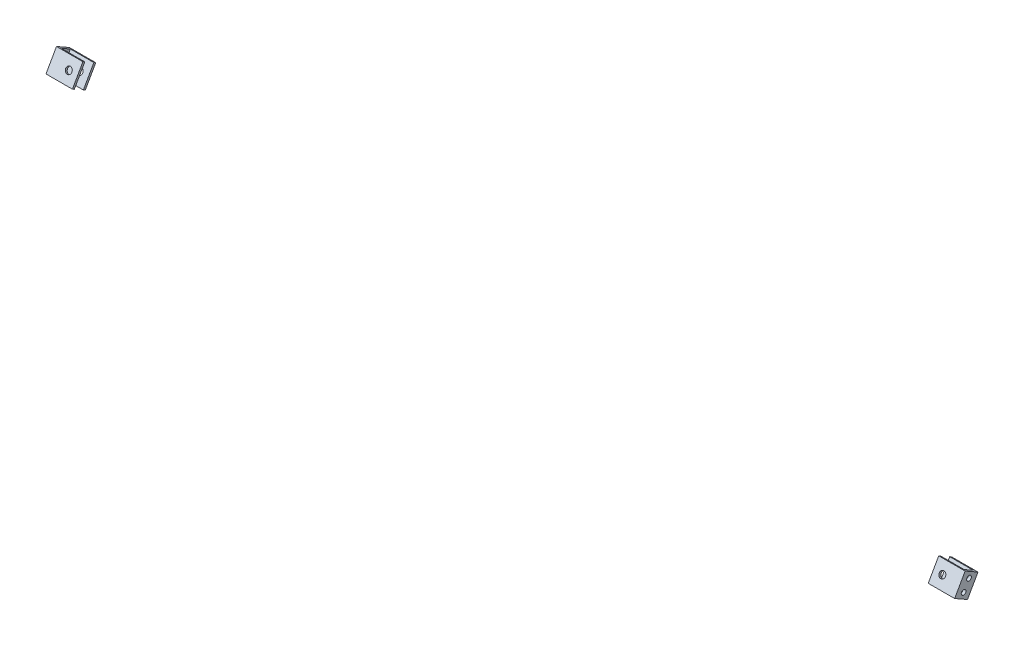
ISO-10303-21;
HEADER;
FILE_DESCRIPTION(('STEP AP214'),'2;1');
FILE_NAME('part.step','',(''),(''),'','','');
FILE_SCHEMA(('AUTOMOTIVE_DESIGN { 1 0 10303 214 1 1 1 1 }'));
ENDSEC;
DATA;
#1=APPLICATION_CONTEXT('core data for automotive mechanical design processes');
#2=APPLICATION_PROTOCOL_DEFINITION('international standard','automotive_design',2000,#1);
#3=PRODUCT_CONTEXT('',#1,'mechanical');
#4=PRODUCT('Part','Part','',(#3));
#5=PRODUCT_RELATED_PRODUCT_CATEGORY('part','',(#4));
#6=PRODUCT_DEFINITION_FORMATION('','',#4);
#7=PRODUCT_DEFINITION_CONTEXT('part definition',#1,'design');
#8=PRODUCT_DEFINITION('design','',#6,#7);
#9=PRODUCT_DEFINITION_SHAPE('','',#8);
#10=(LENGTH_UNIT() NAMED_UNIT(*) SI_UNIT(.MILLI.,.METRE.));
#11=(NAMED_UNIT(*) PLANE_ANGLE_UNIT() SI_UNIT($,.RADIAN.));
#12=(NAMED_UNIT(*) SI_UNIT($,.STERADIAN.) SOLID_ANGLE_UNIT());
#13=UNCERTAINTY_MEASURE_WITH_UNIT(LENGTH_MEASURE(1.E-05),#10,'distance_accuracy_value','');
#14=(GEOMETRIC_REPRESENTATION_CONTEXT(3) GLOBAL_UNCERTAINTY_ASSIGNED_CONTEXT((#13)) GLOBAL_UNIT_ASSIGNED_CONTEXT((#10,
#11,#12)) REPRESENTATION_CONTEXT('',''));
#15=CARTESIAN_POINT('',(0.,0.,0.));
#16=DIRECTION('',(0.,0.,1.));
#17=DIRECTION('',(1.,0.,0.));
#18=AXIS2_PLACEMENT_3D('',#15,#16,#17);
#19=CARTESIAN_POINT('',(459.128999952,901.235804059875,-1027.71365527703));
#20=DIRECTION('',(1.,0.,0.));
#21=DIRECTION('',(0.,0.,1.));
#22=AXIS2_PLACEMENT_3D('',#19,#20,#21);
#23=PLANE('',#22);
#24=DIRECTION('',(0.,0.492683829577063,0.87020839117609));
#25=VECTOR('',#24,1.);
#26=CARTESIAN_POINT('',(459.128999952,881.342840237589,-1016.4509029329));
#27=LINE('',#26,#25);
#28=CARTESIAN_POINT('',(459.128999952,887.990992662945,-1004.70852845446));
#29=VERTEX_POINT('',#28);
#30=CARTESIAN_POINT('',(459.128999952,889.164196032125,-1002.63634472297));
#31=VERTEX_POINT('',#30);
#32=EDGE_CURVE('E174',#29,#31,#27,.T.);
#33=ORIENTED_EDGE('',*,*,#32,.T.);
#34=DIRECTION('',(0.,-0.87020839117609,0.492683829577064));
#35=VECTOR('',#34,1.);
#36=CARTESIAN_POINT('',(459.128999952,909.057159854411,-1013.89909706711));
#37=LINE('',#36,#35);
#38=CARTESIAN_POINT('',(459.128999952,909.057159854411,-1013.89909706711));
#39=VERTEX_POINT('',#38);
#40=EDGE_CURVE('E167',#39,#31,#37,.T.);
#41=ORIENTED_EDGE('',*,*,#40,.F.);
#42=DIRECTION('',(0.,0.492683829577063,0.87020839117609));
#43=VECTOR('',#42,1.);
#44=CARTESIAN_POINT('',(459.128999952,901.235804059875,-1027.71365527703));
#45=LINE('',#44,#43);
#46=CARTESIAN_POINT('',(459.128999952,907.88395648523,-1015.97128079859));
#47=VERTEX_POINT('',#46);
#48=EDGE_CURVE('E183',#47,#39,#45,.T.);
#49=ORIENTED_EDGE('',*,*,#48,.F.);
#50=DIRECTION('',(0.,0.87020839117609,-0.492683829577063));
#51=VECTOR('',#50,1.);
#52=CARTESIAN_POINT('',(459.128999952,907.88395648523,-1015.97128079859));
#53=LINE('',#52,#51);
#54=EDGE_CURVE('E152',#29,#47,#53,.T.);
#55=ORIENTED_EDGE('',*,*,#54,.F.);
#56=EDGE_LOOP('',(#33,#41,#49,#55));
#57=FACE_BOUND('',#56,.T.);
#58=ADVANCED_FACE('F49',(#57),#23,.F.);
#59=CARTESIAN_POINT('',(468.653999952,891.289322148732,-1022.08227910496));
#60=DIRECTION('',(0.,0.492683829577063,0.87020839117609));
#61=DIRECTION('',(0.,-0.870208391176091,0.492683829577063));
#62=AXIS2_PLACEMENT_3D('',#59,#60,#61);
#63=CYLINDRICAL_SURFACE('',#62,3.37820000000002);
#64=CARTESIAN_POINT('',(468.653999952,897.937474574087,-1010.33990462653));
#65=DIRECTION('',(0.,-0.492683829577063,-0.87020839117609));
#66=DIRECTION('',(0.,-0.87020839117609,0.492683829577063));
#67=AXIS2_PLACEMENT_3D('',#64,#65,#66);
#68=CIRCLE('',#67,3.37820000000002);
#69=CARTESIAN_POINT('',(468.653999952,894.997736587016,-1008.67552011345));
#70=VERTEX_POINT('',#69);
#71=EDGE_CURVE('E151',#70,#70,#68,.T.);
#72=ORIENTED_EDGE('',*,*,#71,.T.);
#73=EDGE_LOOP('',(#72));
#74=FACE_BOUND('',#73,.T.);
#75=CARTESIAN_POINT('',(468.653999952,899.110677943268,-1008.26772089504));
#76=DIRECTION('',(0.,0.492683829577063,0.870208391176091));
#77=DIRECTION('',(0.,0.870208391176091,-0.492683829577063));
#78=AXIS2_PLACEMENT_3D('',#75,#76,#77);
#79=CIRCLE('',#78,3.37820000000002);
#80=CARTESIAN_POINT('',(468.653999952,902.050415930339,-1009.93210540812));
#81=VERTEX_POINT('',#80);
#82=EDGE_CURVE('E158',#81,#81,#79,.T.);
#83=ORIENTED_EDGE('',*,*,#82,.T.);
#84=EDGE_LOOP('',(#83));
#85=FACE_BOUND('',#84,.T.);
#86=ADVANCED_FACE('F220',(#74,#85),#63,.F.);
#87=CARTESIAN_POINT('',(0.,-221.855892676126,-391.855481850006));
#88=DIRECTION('',(0.,0.492683829577064,0.87020839117609));
#89=DIRECTION('',(0.,-0.87020839117609,0.492683829577064));
#90=AXIS2_PLACEMENT_3D('',#87,#88,#89);
#91=PLANE('',#90);
#92=DIRECTION('',(1.,0.,0.));
#93=VECTOR('',#92,1.);
#94=CARTESIAN_POINT('',(459.128999952,881.342840237589,-1016.4509029329));
#95=LINE('',#94,#93);
#96=CARTESIAN_POINT('',(459.128999952,881.342840237589,-1016.4509029329));
#97=VERTEX_POINT('',#96);
#98=CARTESIAN_POINT('',(487.449999952,881.342840237589,-1016.4509029329));
#99=VERTEX_POINT('',#98);
#100=EDGE_CURVE('E164',#97,#99,#95,.T.);
#101=ORIENTED_EDGE('',*,*,#100,.F.);
#102=DIRECTION('',(0.,-0.87020839117609,0.492683829577064));
#103=VECTOR('',#102,1.);
#104=CARTESIAN_POINT('',(459.128999952,901.235804059875,-1027.71365527703));
#105=LINE('',#104,#103);
#106=CARTESIAN_POINT('',(459.128999952,901.235804059875,-1027.71365527703));
#107=VERTEX_POINT('',#106);
#108=EDGE_CURVE('E172',#107,#97,#105,.T.);
#109=ORIENTED_EDGE('',*,*,#108,.F.);
#110=DIRECTION('',(-1.,0.,0.));
#111=VECTOR('',#110,1.);
#112=CARTESIAN_POINT('',(487.449999952,901.235804059875,-1027.71365527703));
#113=LINE('',#112,#111);
#114=CARTESIAN_POINT('',(487.449999952,901.235804059875,-1027.71365527703));
#115=VERTEX_POINT('',#114);
#116=EDGE_CURVE('E169',#115,#107,#113,.T.);
#117=ORIENTED_EDGE('',*,*,#116,.F.);
#118=DIRECTION('',(0.,0.87020839117609,-0.492683829577064));
#119=VECTOR('',#118,1.);
#120=CARTESIAN_POINT('',(487.449999952,901.235804059875,-1027.71365527703));
#121=LINE('',#120,#119);
#122=EDGE_CURVE('E166',#99,#115,#121,.T.);
#123=ORIENTED_EDGE('',*,*,#122,.F.);
#124=EDGE_LOOP('',(#101,#109,#117,#123));
#125=FACE_BOUND('',#124,.T.);
#126=CARTESIAN_POINT('',(468.653999952,891.289322148732,-1022.08227910496));
#127=DIRECTION('',(0.,0.492683829577063,0.870208391176091));
#128=DIRECTION('',(0.,0.870208391176091,-0.492683829577063));
#129=AXIS2_PLACEMENT_3D('',#126,#127,#128);
#130=CIRCLE('',#129,3.37820000000002);
#131=CARTESIAN_POINT('',(468.653999952,894.229060135803,-1023.74666361804));
#132=VERTEX_POINT('',#131);
#133=EDGE_CURVE('E159',#132,#132,#130,.T.);
#134=ORIENTED_EDGE('',*,*,#133,.T.);
#135=EDGE_LOOP('',(#134));
#136=FACE_BOUND('',#135,.T.);
#137=ADVANCED_FACE('F227',(#125,#136),#91,.F.);
#138=CARTESIAN_POINT('',(0.,-214.03453688159,-378.040923640085));
#139=DIRECTION('',(0.,0.492683829577064,0.87020839117609));
#140=DIRECTION('',(0.,-0.87020839117609,0.492683829577064));
#141=AXIS2_PLACEMENT_3D('',#138,#139,#140);
#142=PLANE('',#141);
#143=DIRECTION('',(1.,0.,0.));
#144=VECTOR('',#143,1.);
#145=CARTESIAN_POINT('',(459.128999952,889.164196032125,-1002.63634472297));
#146=LINE('',#145,#144);
#147=CARTESIAN_POINT('',(487.449999952,889.164196032125,-1002.63634472297));
#148=VERTEX_POINT('',#147);
#149=EDGE_CURVE('E95',#31,#148,#146,.T.);
#150=ORIENTED_EDGE('',*,*,#149,.T.);
#151=DIRECTION('',(0.,0.87020839117609,-0.492683829577064));
#152=VECTOR('',#151,1.);
#153=CARTESIAN_POINT('',(487.449999952,909.057159854411,-1013.89909706711));
#154=LINE('',#153,#152);
#155=CARTESIAN_POINT('',(487.449999952,909.057159854411,-1013.89909706711));
#156=VERTEX_POINT('',#155);
#157=EDGE_CURVE('E176',#148,#156,#154,.T.);
#158=ORIENTED_EDGE('',*,*,#157,.T.);
#159=DIRECTION('',(-1.,0.,0.));
#160=VECTOR('',#159,1.);
#161=CARTESIAN_POINT('',(487.449999952,909.057159854411,-1013.89909706711));
#162=LINE('',#161,#160);
#163=EDGE_CURVE('E179',#156,#39,#162,.T.);
#164=ORIENTED_EDGE('',*,*,#163,.T.);
#165=ORIENTED_EDGE('',*,*,#40,.T.);
#166=EDGE_LOOP('',(#150,#158,#164,#165));
#167=FACE_BOUND('',#166,.T.);
#168=ORIENTED_EDGE('',*,*,#82,.F.);
#169=EDGE_LOOP('',(#168));
#170=FACE_BOUND('',#169,.T.);
#171=ADVANCED_FACE('F251',(#167,#170),#142,.T.);
#172=CARTESIAN_POINT('',(459.128999952,881.342840237589,-1016.4509029329));
#173=DIRECTION('',(0.,0.87020839117609,-0.492683829577063));
#174=DIRECTION('',(0.,0.492683829577063,0.870208391176091));
#175=AXIS2_PLACEMENT_3D('',#172,#173,#174);
#176=PLANE('',#175);
#177=DIRECTION('',(0.,-0.492683829577068,-0.870208391176088));
#178=VECTOR('',#177,1.);
#179=CARTESIAN_POINT('',(484.274999952,887.990992662945,-1004.70852845446));
#180=LINE('',#179,#178);
#181=CARTESIAN_POINT('',(484.274999952,887.990992662945,-1004.70852845446));
#182=VERTEX_POINT('',#181);
#183=CARTESIAN_POINT('',(484.274999952,882.51604360677,-1014.37871920141));
#184=VERTEX_POINT('',#183);
#185=EDGE_CURVE('E128',#182,#184,#180,.T.);
#186=ORIENTED_EDGE('',*,*,#185,.T.);
#187=DIRECTION('',(-1.,0.,0.));
#188=VECTOR('',#187,1.);
#189=CARTESIAN_POINT('',(484.274999952,882.51604360677,-1014.37871920141));
#190=LINE('',#189,#188);
#191=CARTESIAN_POINT('',(459.128999952,882.51604360677,-1014.37871920141));
#192=VERTEX_POINT('',#191);
#193=EDGE_CURVE('E134',#184,#192,#190,.T.);
#194=ORIENTED_EDGE('',*,*,#193,.T.);
#195=EDGE_CURVE('E74',#97,#192,#27,.T.);
#196=ORIENTED_EDGE('',*,*,#195,.F.);
#197=ORIENTED_EDGE('',*,*,#100,.T.);
#198=DIRECTION('',(0.,0.492683829577063,0.87020839117609));
#199=VECTOR('',#198,1.);
#200=CARTESIAN_POINT('',(487.449999952,881.342840237589,-1016.4509029329));
#201=LINE('',#200,#199);
#202=EDGE_CURVE('E58',#99,#148,#201,.T.);
#203=ORIENTED_EDGE('',*,*,#202,.T.);
#204=ORIENTED_EDGE('',*,*,#149,.F.);
#205=ORIENTED_EDGE('',*,*,#32,.F.);
#206=DIRECTION('',(1.,0.,0.));
#207=VECTOR('',#206,1.);
#208=CARTESIAN_POINT('',(484.274999952,887.990992662945,-1004.70852845446));
#209=LINE('',#208,#207);
#210=EDGE_CURVE('E132',#29,#182,#209,.T.);
#211=ORIENTED_EDGE('',*,*,#210,.T.);
#212=EDGE_LOOP('',(#186,#194,#196,#197,#203,#204,#205,#211));
#213=FACE_BOUND('',#212,.T.);
#214=ADVANCED_FACE('F51',(#213),#176,.F.);
#215=CARTESIAN_POINT('',(487.449999952,901.235804059875,-1027.71365527703));
#216=DIRECTION('',(-1.,0.,0.));
#217=DIRECTION('',(0.,0.,-1.));
#218=AXIS2_PLACEMENT_3D('',#215,#216,#217);
#219=PLANE('',#218);
#220=CARTESIAN_POINT('',(487.449999952,900.305860760387,-1018.06577310166));
#221=DIRECTION('',(-1.,0.,0.));
#222=DIRECTION('',(0.,0.,1.));
#223=AXIS2_PLACEMENT_3D('',#220,#221,#222);
#224=CIRCLE('',#223,2.55270000000026);
#225=CARTESIAN_POINT('',(487.449999952,900.305860760387,-1015.51307310166));
#226=VERTEX_POINT('',#225);
#227=EDGE_CURVE('E194',#226,#226,#224,.T.);
#228=ORIENTED_EDGE('',*,*,#227,.T.);
#229=EDGE_LOOP('',(#228));
#230=FACE_BOUND('',#229,.T.);
#231=CARTESIAN_POINT('',(487.449999952,890.094139331613,-1012.28422689834));
#232=DIRECTION('',(-1.,0.,0.));
#233=DIRECTION('',(0.,0.,1.));
#234=AXIS2_PLACEMENT_3D('',#231,#232,#233);
#235=CIRCLE('',#234,2.55270000000005);
#236=CARTESIAN_POINT('',(487.449999952,890.094139331613,-1009.73152689834));
#237=VERTEX_POINT('',#236);
#238=EDGE_CURVE('E142',#237,#237,#235,.T.);
#239=ORIENTED_EDGE('',*,*,#238,.T.);
#240=EDGE_LOOP('',(#239));
#241=FACE_BOUND('',#240,.T.);
#242=ORIENTED_EDGE('',*,*,#157,.F.);
#243=ORIENTED_EDGE('',*,*,#202,.F.);
#244=ORIENTED_EDGE('',*,*,#122,.T.);
#245=DIRECTION('',(0.,0.492683829577063,0.87020839117609));
#246=VECTOR('',#245,1.);
#247=CARTESIAN_POINT('',(487.449999952,901.235804059875,-1027.71365527703));
#248=LINE('',#247,#246);
#249=EDGE_CURVE('E187',#115,#156,#248,.T.);
#250=ORIENTED_EDGE('',*,*,#249,.T.);
#251=EDGE_LOOP('',(#242,#243,#244,#250));
#252=FACE_BOUND('',#251,.T.);
#253=ADVANCED_FACE('F203',(#230,#241,#252),#219,.F.);
#254=CARTESIAN_POINT('',(487.449999952,901.235804059875,-1027.71365527703));
#255=DIRECTION('',(0.,-0.87020839117609,0.492683829577063));
#256=DIRECTION('',(0.,-0.492683829577063,-0.870208391176091));
#257=AXIS2_PLACEMENT_3D('',#254,#255,#256);
#258=PLANE('',#257);
#259=ORIENTED_EDGE('',*,*,#48,.T.);
#260=ORIENTED_EDGE('',*,*,#163,.F.);
#261=ORIENTED_EDGE('',*,*,#249,.F.);
#262=ORIENTED_EDGE('',*,*,#116,.T.);
#263=CARTESIAN_POINT('',(459.128999952,902.409007429055,-1025.64147154554));
#264=VERTEX_POINT('',#263);
#265=EDGE_CURVE('E184',#107,#264,#45,.T.);
#266=ORIENTED_EDGE('',*,*,#265,.T.);
#267=DIRECTION('',(-1.,0.,0.));
#268=VECTOR('',#267,1.);
#269=CARTESIAN_POINT('',(487.449999952,902.409007429055,-1025.64147154554));
#270=LINE('',#269,#268);
#271=CARTESIAN_POINT('',(484.274999952,902.409007429055,-1025.64147154554));
#272=VERTEX_POINT('',#271);
#273=EDGE_CURVE('E149',#272,#264,#270,.T.);
#274=ORIENTED_EDGE('',*,*,#273,.F.);
#275=DIRECTION('',(0.,-0.492683829577063,-0.870208391176091));
#276=VECTOR('',#275,1.);
#277=CARTESIAN_POINT('',(484.274999952,901.235804059875,-1027.71365527703));
#278=LINE('',#277,#276);
#279=CARTESIAN_POINT('',(484.274999952,907.88395648523,-1015.97128079859));
#280=VERTEX_POINT('',#279);
#281=EDGE_CURVE('E12',#280,#272,#278,.T.);
#282=ORIENTED_EDGE('',*,*,#281,.F.);
#283=DIRECTION('',(1.,0.,0.));
#284=VECTOR('',#283,1.);
#285=CARTESIAN_POINT('',(487.449999952,907.88395648523,-1015.97128079859));
#286=LINE('',#285,#284);
#287=EDGE_CURVE('E155',#47,#280,#286,.T.);
#288=ORIENTED_EDGE('',*,*,#287,.F.);
#289=EDGE_LOOP('',(#259,#260,#261,#262,#266,#274,#282,#288));
#290=FACE_BOUND('',#289,.T.);
#291=ADVANCED_FACE('F235',(#290),#258,.F.);
#292=ORIENTED_EDGE('',*,*,#265,.F.);
#293=ORIENTED_EDGE('',*,*,#108,.T.);
#294=ORIENTED_EDGE('',*,*,#195,.T.);
#295=DIRECTION('',(0.,-0.87020839117609,0.492683829577063));
#296=VECTOR('',#295,1.);
#297=CARTESIAN_POINT('',(459.128999952,902.409007429055,-1025.64147154554));
#298=LINE('',#297,#296);
#299=EDGE_CURVE('E66',#264,#192,#298,.T.);
#300=ORIENTED_EDGE('',*,*,#299,.F.);
#301=EDGE_LOOP('',(#292,#293,#294,#300));
#302=FACE_BOUND('',#301,.T.);
#303=ADVANCED_FACE('F223',(#302),#23,.F.);
#304=CARTESIAN_POINT('',(468.653999952,892.462525517912,-1020.01009537347));
#305=DIRECTION('',(0.,0.492683829577063,0.87020839117609));
#306=DIRECTION('',(0.,0.87020839117609,-0.492683829577063));
#307=AXIS2_PLACEMENT_3D('',#304,#305,#306);
#308=CIRCLE('',#307,3.37820000000002);
#309=CARTESIAN_POINT('',(468.653999952,895.402263504983,-1021.67447988655));
#310=VERTEX_POINT('',#309);
#311=EDGE_CURVE('E146',#310,#310,#308,.T.);
#312=ORIENTED_EDGE('',*,*,#311,.T.);
#313=EDGE_LOOP('',(#312));
#314=FACE_BOUND('',#313,.T.);
#315=ORIENTED_EDGE('',*,*,#133,.F.);
#316=EDGE_LOOP('',(#315));
#317=FACE_BOUND('',#316,.T.);
#318=ADVANCED_FACE('F230',(#314,#317),#63,.F.);
#319=CARTESIAN_POINT('',(484.274999952,913.806777054439,-1019.32459013177));
#320=DIRECTION('',(1.,0.,0.));
#321=DIRECTION('',(0.,0.,1.));
#322=AXIS2_PLACEMENT_3D('',#319,#320,#321);
#323=PLANE('',#322);
#324=CARTESIAN_POINT('',(484.274999952,900.305860760387,-1018.06577310166));
#325=DIRECTION('',(-1.,0.,0.));
#326=DIRECTION('',(0.,0.,1.));
#327=AXIS2_PLACEMENT_3D('',#324,#325,#326);
#328=CIRCLE('',#327,2.55270000000026);
#329=CARTESIAN_POINT('',(484.274999952,900.305860760387,-1015.51307310166));
#330=VERTEX_POINT('',#329);
#331=EDGE_CURVE('E53',#330,#330,#328,.T.);
#332=ORIENTED_EDGE('',*,*,#331,.F.);
#333=EDGE_LOOP('',(#332));
#334=FACE_BOUND('',#333,.T.);
#335=CARTESIAN_POINT('',(484.274999952,890.094139331613,-1012.28422689834));
#336=DIRECTION('',(-1.,0.,0.));
#337=DIRECTION('',(0.,0.,1.));
#338=AXIS2_PLACEMENT_3D('',#335,#336,#337);
#339=CIRCLE('',#338,2.55270000000005);
#340=CARTESIAN_POINT('',(484.274999952,890.094139331613,-1009.73152689834));
#341=VERTEX_POINT('',#340);
#342=EDGE_CURVE('E140',#341,#341,#339,.T.);
#343=ORIENTED_EDGE('',*,*,#342,.F.);
#344=EDGE_LOOP('',(#343));
#345=FACE_BOUND('',#344,.T.);
#346=DIRECTION('',(0.,-0.87020839117609,0.492683829577063));
#347=VECTOR('',#346,1.);
#348=CARTESIAN_POINT('',(484.274999952,913.806777054439,-1019.32459013177));
#349=LINE('',#348,#347);
#350=EDGE_CURVE('E131',#280,#182,#349,.T.);
#351=ORIENTED_EDGE('',*,*,#350,.F.);
#352=ORIENTED_EDGE('',*,*,#281,.T.);
#353=DIRECTION('',(0.,-0.87020839117609,0.492683829577063));
#354=VECTOR('',#353,1.);
#355=CARTESIAN_POINT('',(484.274999952,908.331827998263,-1028.99478087871));
#356=LINE('',#355,#354);
#357=EDGE_CURVE('E125',#272,#184,#356,.T.);
#358=ORIENTED_EDGE('',*,*,#357,.T.);
#359=ORIENTED_EDGE('',*,*,#185,.F.);
#360=EDGE_LOOP('',(#351,#352,#358,#359));
#361=FACE_BOUND('',#360,.T.);
#362=ADVANCED_FACE('F126',(#334,#345,#361),#323,.F.);
#363=CARTESIAN_POINT('',(484.274999952,913.806777054439,-1019.32459013177));
#364=DIRECTION('',(0.,0.492683829577063,0.87020839117609));
#365=DIRECTION('',(0.,-0.87020839117609,0.492683829577063));
#366=AXIS2_PLACEMENT_3D('',#363,#364,#365);
#367=PLANE('',#366);
#368=ORIENTED_EDGE('',*,*,#71,.F.);
#369=EDGE_LOOP('',(#368));
#370=FACE_BOUND('',#369,.T.);
#371=ORIENTED_EDGE('',*,*,#54,.T.);
#372=ORIENTED_EDGE('',*,*,#287,.T.);
#373=ORIENTED_EDGE('',*,*,#350,.T.);
#374=ORIENTED_EDGE('',*,*,#210,.F.);
#375=EDGE_LOOP('',(#371,#372,#373,#374));
#376=FACE_BOUND('',#375,.T.);
#377=ADVANCED_FACE('F215',(#370,#376),#367,.F.);
#378=CARTESIAN_POINT('',(484.274999952,908.331827998263,-1028.99478087871));
#379=DIRECTION('',(0.,-0.492683829577063,-0.87020839117609));
#380=DIRECTION('',(0.,0.87020839117609,-0.492683829577063));
#381=AXIS2_PLACEMENT_3D('',#378,#379,#380);
#382=PLANE('',#381);
#383=ORIENTED_EDGE('',*,*,#311,.F.);
#384=EDGE_LOOP('',(#383));
#385=FACE_BOUND('',#384,.T.);
#386=ORIENTED_EDGE('',*,*,#357,.F.);
#387=ORIENTED_EDGE('',*,*,#273,.T.);
#388=ORIENTED_EDGE('',*,*,#299,.T.);
#389=ORIENTED_EDGE('',*,*,#193,.F.);
#390=EDGE_LOOP('',(#386,#387,#388,#389));
#391=FACE_BOUND('',#390,.T.);
#392=ADVANCED_FACE('F135',(#385,#391),#382,.F.);
#393=CARTESIAN_POINT('',(459.128999952,890.094139331613,-1012.28422689834));
#394=DIRECTION('',(1.,0.,0.));
#395=DIRECTION('',(0.,0.,1.));
#396=AXIS2_PLACEMENT_3D('',#393,#394,#395);
#397=CYLINDRICAL_SURFACE('',#396,2.55270000000005);
#398=ORIENTED_EDGE('',*,*,#238,.F.);
#399=EDGE_LOOP('',(#398));
#400=FACE_BOUND('',#399,.T.);
#401=ORIENTED_EDGE('',*,*,#342,.T.);
#402=EDGE_LOOP('',(#401));
#403=FACE_BOUND('',#402,.T.);
#404=ADVANCED_FACE('F205',(#400,#403),#397,.F.);
#405=CARTESIAN_POINT('',(459.128999952,900.305860760387,-1018.06577310166));
#406=DIRECTION('',(1.,0.,0.));
#407=DIRECTION('',(0.,0.,1.));
#408=AXIS2_PLACEMENT_3D('',#405,#406,#407);
#409=CYLINDRICAL_SURFACE('',#408,2.55270000000026);
#410=ORIENTED_EDGE('',*,*,#227,.F.);
#411=EDGE_LOOP('',(#410));
#412=FACE_BOUND('',#411,.T.);
#413=ORIENTED_EDGE('',*,*,#331,.T.);
#414=EDGE_LOOP('',(#413));
#415=FACE_BOUND('',#414,.T.);
#416=ADVANCED_FACE('F207',(#412,#415),#409,.F.);
#417=CLOSED_SHELL('',(#58,#86,#137,#171,#214,#253,#291,#303,#318,#362,#377,#392,#404,#416));
#418=MANIFOLD_SOLID_BREP('B2',#417);
#419=CARTESIAN_POINT('',(-459.128999952,901.235804059875,-1027.71365527703));
#420=DIRECTION('',(-1.,0.,0.));
#421=DIRECTION('',(0.,0.,1.));
#422=AXIS2_PLACEMENT_3D('',#419,#420,#421);
#423=PLANE('',#422);
#424=DIRECTION('',(0.,0.492683829577063,0.87020839117609));
#425=VECTOR('',#424,1.);
#426=CARTESIAN_POINT('',(-459.128999952,881.342840237589,-1016.4509029329));
#427=LINE('',#426,#425);
#428=CARTESIAN_POINT('',(-459.128999952,887.990992662945,-1004.70852845446));
#429=VERTEX_POINT('',#428);
#430=CARTESIAN_POINT('',(-459.128999952,889.164196032125,-1002.63634472297));
#431=VERTEX_POINT('',#430);
#432=EDGE_CURVE('E405',#429,#431,#427,.T.);
#433=ORIENTED_EDGE('',*,*,#432,.F.);
#434=DIRECTION('',(0.,0.87020839117609,-0.492683829577063));
#435=VECTOR('',#434,1.);
#436=CARTESIAN_POINT('',(-459.128999952,907.88395648523,-1015.97128079859));
#437=LINE('',#436,#435);
#438=CARTESIAN_POINT('',(-459.128999952,907.88395648523,-1015.97128079859));
#439=VERTEX_POINT('',#438);
#440=EDGE_CURVE('E461',#429,#439,#437,.T.);
#441=ORIENTED_EDGE('',*,*,#440,.T.);
#442=DIRECTION('',(0.,0.492683829577063,0.87020839117609));
#443=VECTOR('',#442,1.);
#444=CARTESIAN_POINT('',(-459.128999952,901.235804059875,-1027.71365527703));
#445=LINE('',#444,#443);
#446=CARTESIAN_POINT('',(-459.128999952,909.057159854411,-1013.89909706711));
#447=VERTEX_POINT('',#446);
#448=EDGE_CURVE('E489',#439,#447,#445,.T.);
#449=ORIENTED_EDGE('',*,*,#448,.T.);
#450=DIRECTION('',(0.,-0.87020839117609,0.492683829577064));
#451=VECTOR('',#450,1.);
#452=CARTESIAN_POINT('',(-459.128999952,909.057159854411,-1013.89909706711));
#453=LINE('',#452,#451);
#454=EDGE_CURVE('E476',#447,#431,#453,.T.);
#455=ORIENTED_EDGE('',*,*,#454,.T.);
#456=EDGE_LOOP('',(#433,#441,#449,#455));
#457=FACE_BOUND('',#456,.T.);
#458=ADVANCED_FACE('F357',(#457),#423,.F.);
#459=CARTESIAN_POINT('',(-468.653999952,891.289322148732,-1022.08227910496));
#460=DIRECTION('',(0.,0.492683829577063,0.87020839117609));
#461=DIRECTION('',(0.,-0.870208391176091,0.492683829577063));
#462=AXIS2_PLACEMENT_3D('',#459,#460,#461);
#463=CYLINDRICAL_SURFACE('',#462,3.37820000000002);
#464=CARTESIAN_POINT('',(-468.653999952,897.937474574087,-1010.33990462653));
#465=DIRECTION('',(0.,0.492683829577063,0.87020839117609));
#466=DIRECTION('',(0.,-0.87020839117609,0.492683829577063));
#467=AXIS2_PLACEMENT_3D('',#464,#465,#466);
#468=CIRCLE('',#467,3.37820000000002);
#469=CARTESIAN_POINT('',(-468.653999952,894.997736587016,-1008.67552011345));
#470=VERTEX_POINT('',#469);
#471=EDGE_CURVE('E460',#470,#470,#468,.T.);
#472=ORIENTED_EDGE('',*,*,#471,.F.);
#473=EDGE_LOOP('',(#472));
#474=FACE_BOUND('',#473,.T.);
#475=CARTESIAN_POINT('',(-468.653999952,899.110677943268,-1008.26772089504));
#476=DIRECTION('',(0.,-0.492683829577063,-0.870208391176091));
#477=DIRECTION('',(0.,0.870208391176091,-0.492683829577063));
#478=AXIS2_PLACEMENT_3D('',#475,#476,#477);
#479=CIRCLE('',#478,3.37820000000002);
#480=CARTESIAN_POINT('',(-468.653999952,902.050415930339,-1009.93210540812));
#481=VERTEX_POINT('',#480);
#482=EDGE_CURVE('E467',#481,#481,#479,.T.);
#483=ORIENTED_EDGE('',*,*,#482,.F.);
#484=EDGE_LOOP('',(#483));
#485=FACE_BOUND('',#484,.T.);
#486=ADVANCED_FACE('F550',(#474,#485),#463,.F.);
#487=CARTESIAN_POINT('',(0.,-221.855892676126,-391.855481850006));
#488=DIRECTION('',(0.,0.492683829577064,0.87020839117609));
#489=DIRECTION('',(0.,-0.87020839117609,0.492683829577064));
#490=AXIS2_PLACEMENT_3D('',#487,#488,#489);
#491=PLANE('',#490);
#492=DIRECTION('',(-1.,0.,0.));
#493=VECTOR('',#492,1.);
#494=CARTESIAN_POINT('',(-459.128999952,881.342840237589,-1016.4509029329));
#495=LINE('',#494,#493);
#496=CARTESIAN_POINT('',(-459.128999952,881.342840237589,-1016.4509029329));
#497=VERTEX_POINT('',#496);
#498=CARTESIAN_POINT('',(-487.449999952,881.342840237589,-1016.4509029329));
#499=VERTEX_POINT('',#498);
#500=EDGE_CURVE('E474',#497,#499,#495,.T.);
#501=ORIENTED_EDGE('',*,*,#500,.T.);
#502=DIRECTION('',(0.,0.87020839117609,-0.492683829577064));
#503=VECTOR('',#502,1.);
#504=CARTESIAN_POINT('',(-487.449999952,901.235804059875,-1027.71365527703));
#505=LINE('',#504,#503);
#506=CARTESIAN_POINT('',(-487.449999952,901.235804059875,-1027.71365527703));
#507=VERTEX_POINT('',#506);
#508=EDGE_CURVE('E413',#499,#507,#505,.T.);
#509=ORIENTED_EDGE('',*,*,#508,.T.);
#510=DIRECTION('',(1.,0.,0.));
#511=VECTOR('',#510,1.);
#512=CARTESIAN_POINT('',(-487.449999952,901.235804059875,-1027.71365527703));
#513=LINE('',#512,#511);
#514=CARTESIAN_POINT('',(-459.128999952,901.235804059875,-1027.71365527703));
#515=VERTEX_POINT('',#514);
#516=EDGE_CURVE('E478',#507,#515,#513,.T.);
#517=ORIENTED_EDGE('',*,*,#516,.T.);
#518=DIRECTION('',(0.,-0.87020839117609,0.492683829577064));
#519=VECTOR('',#518,1.);
#520=CARTESIAN_POINT('',(-459.128999952,901.235804059875,-1027.71365527703));
#521=LINE('',#520,#519);
#522=EDGE_CURVE('E383',#515,#497,#521,.T.);
#523=ORIENTED_EDGE('',*,*,#522,.T.);
#524=EDGE_LOOP('',(#501,#509,#517,#523));
#525=FACE_BOUND('',#524,.T.);
#526=CARTESIAN_POINT('',(-468.653999952,891.289322148732,-1022.08227910496));
#527=DIRECTION('',(0.,-0.492683829577063,-0.870208391176091));
#528=DIRECTION('',(0.,0.870208391176091,-0.492683829577063));
#529=AXIS2_PLACEMENT_3D('',#526,#527,#528);
#530=CIRCLE('',#529,3.37820000000002);
#531=CARTESIAN_POINT('',(-468.653999952,894.229060135803,-1023.74666361804));
#532=VERTEX_POINT('',#531);
#533=EDGE_CURVE('E468',#532,#532,#530,.T.);
#534=ORIENTED_EDGE('',*,*,#533,.F.);
#535=EDGE_LOOP('',(#534));
#536=FACE_BOUND('',#535,.T.);
#537=ADVANCED_FACE('F557',(#525,#536),#491,.F.);
#538=CARTESIAN_POINT('',(0.,-214.03453688159,-378.040923640085));
#539=DIRECTION('',(0.,0.492683829577064,0.87020839117609));
#540=DIRECTION('',(0.,-0.87020839117609,0.492683829577064));
#541=AXIS2_PLACEMENT_3D('',#538,#539,#540);
#542=PLANE('',#541);
#543=DIRECTION('',(-1.,0.,0.));
#544=VECTOR('',#543,1.);
#545=CARTESIAN_POINT('',(-459.128999952,889.164196032125,-1002.63634472297));
#546=LINE('',#545,#544);
#547=CARTESIAN_POINT('',(-487.449999952,889.164196032125,-1002.63634472297));
#548=VERTEX_POINT('',#547);
#549=EDGE_CURVE('E471',#431,#548,#546,.T.);
#550=ORIENTED_EDGE('',*,*,#549,.F.);
#551=ORIENTED_EDGE('',*,*,#454,.F.);
#552=DIRECTION('',(1.,0.,0.));
#553=VECTOR('',#552,1.);
#554=CARTESIAN_POINT('',(-487.449999952,909.057159854411,-1013.89909706711));
#555=LINE('',#554,#553);
#556=CARTESIAN_POINT('',(-487.449999952,909.057159854411,-1013.89909706711));
#557=VERTEX_POINT('',#556);
#558=EDGE_CURVE('E484',#557,#447,#555,.T.);
#559=ORIENTED_EDGE('',*,*,#558,.F.);
#560=DIRECTION('',(0.,0.87020839117609,-0.492683829577064));
#561=VECTOR('',#560,1.);
#562=CARTESIAN_POINT('',(-487.449999952,909.057159854411,-1013.89909706711));
#563=LINE('',#562,#561);
#564=EDGE_CURVE('E482',#548,#557,#563,.T.);
#565=ORIENTED_EDGE('',*,*,#564,.F.);
#566=EDGE_LOOP('',(#550,#551,#559,#565));
#567=FACE_BOUND('',#566,.T.);
#568=ORIENTED_EDGE('',*,*,#482,.T.);
#569=EDGE_LOOP('',(#568));
#570=FACE_BOUND('',#569,.T.);
#571=ADVANCED_FACE('F530',(#567,#570),#542,.T.);
#572=CARTESIAN_POINT('',(-459.128999952,881.342840237589,-1016.4509029329));
#573=DIRECTION('',(0.,0.87020839117609,-0.492683829577063));
#574=DIRECTION('',(0.,0.492683829577063,0.870208391176091));
#575=AXIS2_PLACEMENT_3D('',#572,#573,#574);
#576=PLANE('',#575);
#577=DIRECTION('',(0.,-0.492683829577068,-0.870208391176088));
#578=VECTOR('',#577,1.);
#579=CARTESIAN_POINT('',(-484.274999952,887.990992662945,-1004.70852845446));
#580=LINE('',#579,#578);
#581=CARTESIAN_POINT('',(-484.274999952,887.990992662945,-1004.70852845446));
#582=VERTEX_POINT('',#581);
#583=CARTESIAN_POINT('',(-484.274999952,882.51604360677,-1014.37871920141));
#584=VERTEX_POINT('',#583);
#585=EDGE_CURVE('E443',#582,#584,#580,.T.);
#586=ORIENTED_EDGE('',*,*,#585,.F.);
#587=DIRECTION('',(-1.,0.,0.));
#588=VECTOR('',#587,1.);
#589=CARTESIAN_POINT('',(-484.274999952,887.990992662945,-1004.70852845446));
#590=LINE('',#589,#588);
#591=EDGE_CURVE('E440',#429,#582,#590,.T.);
#592=ORIENTED_EDGE('',*,*,#591,.F.);
#593=ORIENTED_EDGE('',*,*,#432,.T.);
#594=ORIENTED_EDGE('',*,*,#549,.T.);
#595=DIRECTION('',(0.,0.492683829577063,0.87020839117609));
#596=VECTOR('',#595,1.);
#597=CARTESIAN_POINT('',(-487.449999952,881.342840237589,-1016.4509029329));
#598=LINE('',#597,#596);
#599=EDGE_CURVE('E366',#499,#548,#598,.T.);
#600=ORIENTED_EDGE('',*,*,#599,.F.);
#601=ORIENTED_EDGE('',*,*,#500,.F.);
#602=CARTESIAN_POINT('',(-459.128999952,882.51604360677,-1014.37871920141));
#603=VERTEX_POINT('',#602);
#604=EDGE_CURVE('E450',#497,#603,#427,.T.);
#605=ORIENTED_EDGE('',*,*,#604,.T.);
#606=DIRECTION('',(1.,0.,0.));
#607=VECTOR('',#606,1.);
#608=CARTESIAN_POINT('',(-484.274999952,882.51604360677,-1014.37871920141));
#609=LINE('',#608,#607);
#610=EDGE_CURVE('E374',#584,#603,#609,.T.);
#611=ORIENTED_EDGE('',*,*,#610,.F.);
#612=EDGE_LOOP('',(#586,#592,#593,#594,#600,#601,#605,#611));
#613=FACE_BOUND('',#612,.T.);
#614=ADVANCED_FACE('F359',(#613),#576,.F.);
#615=CARTESIAN_POINT('',(-487.449999952,901.235804059875,-1027.71365527703));
#616=DIRECTION('',(1.,0.,0.));
#617=DIRECTION('',(0.,0.,-1.));
#618=AXIS2_PLACEMENT_3D('',#615,#616,#617);
#619=PLANE('',#618);
#620=CARTESIAN_POINT('',(-487.449999952,900.305860760387,-1018.06577310166));
#621=DIRECTION('',(-1.,0.,0.));
#622=DIRECTION('',(0.,0.,1.));
#623=AXIS2_PLACEMENT_3D('',#620,#621,#622);
#624=CIRCLE('',#623,2.55270000000026);
#625=CARTESIAN_POINT('',(-487.449999952,900.305860760387,-1015.51307310166));
#626=VERTEX_POINT('',#625);
#627=EDGE_CURVE('E502',#626,#626,#624,.T.);
#628=ORIENTED_EDGE('',*,*,#627,.F.);
#629=EDGE_LOOP('',(#628));
#630=FACE_BOUND('',#629,.T.);
#631=CARTESIAN_POINT('',(-487.449999952,890.094139331613,-1012.28422689834));
#632=DIRECTION('',(-1.,0.,0.));
#633=DIRECTION('',(0.,0.,1.));
#634=AXIS2_PLACEMENT_3D('',#631,#632,#633);
#635=CIRCLE('',#634,2.55270000000005);
#636=CARTESIAN_POINT('',(-487.449999952,890.094139331613,-1009.73152689834));
#637=VERTEX_POINT('',#636);
#638=EDGE_CURVE('E507',#637,#637,#635,.T.);
#639=ORIENTED_EDGE('',*,*,#638,.F.);
#640=EDGE_LOOP('',(#639));
#641=FACE_BOUND('',#640,.T.);
#642=ORIENTED_EDGE('',*,*,#564,.T.);
#643=DIRECTION('',(0.,0.492683829577063,0.87020839117609));
#644=VECTOR('',#643,1.);
#645=CARTESIAN_POINT('',(-487.449999952,901.235804059875,-1027.71365527703));
#646=LINE('',#645,#644);
#647=EDGE_CURVE('E493',#507,#557,#646,.T.);
#648=ORIENTED_EDGE('',*,*,#647,.F.);
#649=ORIENTED_EDGE('',*,*,#508,.F.);
#650=ORIENTED_EDGE('',*,*,#599,.T.);
#651=EDGE_LOOP('',(#642,#648,#649,#650));
#652=FACE_BOUND('',#651,.T.);
#653=ADVANCED_FACE('F517',(#630,#641,#652),#619,.F.);
#654=CARTESIAN_POINT('',(-487.449999952,901.235804059875,-1027.71365527703));
#655=DIRECTION('',(0.,-0.87020839117609,0.492683829577063));
#656=DIRECTION('',(0.,-0.492683829577063,-0.870208391176091));
#657=AXIS2_PLACEMENT_3D('',#654,#655,#656);
#658=PLANE('',#657);
#659=ORIENTED_EDGE('',*,*,#448,.F.);
#660=DIRECTION('',(-1.,0.,0.));
#661=VECTOR('',#660,1.);
#662=CARTESIAN_POINT('',(-487.449999952,907.88395648523,-1015.97128079859));
#663=LINE('',#662,#661);
#664=CARTESIAN_POINT('',(-484.274999952,907.88395648523,-1015.97128079859));
#665=VERTEX_POINT('',#664);
#666=EDGE_CURVE('E464',#439,#665,#663,.T.);
#667=ORIENTED_EDGE('',*,*,#666,.T.);
#668=DIRECTION('',(0.,-0.492683829577063,-0.870208391176091));
#669=VECTOR('',#668,1.);
#670=CARTESIAN_POINT('',(-484.274999952,901.235804059875,-1027.71365527703));
#671=LINE('',#670,#669);
#672=CARTESIAN_POINT('',(-484.274999952,902.409007429055,-1025.64147154554));
#673=VERTEX_POINT('',#672);
#674=EDGE_CURVE('E47',#665,#673,#671,.T.);
#675=ORIENTED_EDGE('',*,*,#674,.T.);
#676=DIRECTION('',(1.,0.,0.));
#677=VECTOR('',#676,1.);
#678=CARTESIAN_POINT('',(-487.449999952,902.409007429055,-1025.64147154554));
#679=LINE('',#678,#677);
#680=CARTESIAN_POINT('',(-459.128999952,902.409007429055,-1025.64147154554));
#681=VERTEX_POINT('',#680);
#682=EDGE_CURVE('E437',#673,#681,#679,.T.);
#683=ORIENTED_EDGE('',*,*,#682,.T.);
#684=EDGE_CURVE('E490',#515,#681,#445,.T.);
#685=ORIENTED_EDGE('',*,*,#684,.F.);
#686=ORIENTED_EDGE('',*,*,#516,.F.);
#687=ORIENTED_EDGE('',*,*,#647,.T.);
#688=ORIENTED_EDGE('',*,*,#558,.T.);
#689=EDGE_LOOP('',(#659,#667,#675,#683,#685,#686,#687,#688));
#690=FACE_BOUND('',#689,.T.);
#691=ADVANCED_FACE('F519',(#690),#658,.F.);
#692=ORIENTED_EDGE('',*,*,#684,.T.);
#693=DIRECTION('',(0.,-0.87020839117609,0.492683829577063));
#694=VECTOR('',#693,1.);
#695=CARTESIAN_POINT('',(-459.128999952,902.409007429055,-1025.64147154554));
#696=LINE('',#695,#694);
#697=EDGE_CURVE('E457',#681,#603,#696,.T.);
#698=ORIENTED_EDGE('',*,*,#697,.T.);
#699=ORIENTED_EDGE('',*,*,#604,.F.);
#700=ORIENTED_EDGE('',*,*,#522,.F.);
#701=EDGE_LOOP('',(#692,#698,#699,#700));
#702=FACE_BOUND('',#701,.T.);
#703=ADVANCED_FACE('F552',(#702),#423,.F.);
#704=CARTESIAN_POINT('',(-468.653999952,892.462525517912,-1020.01009537347));
#705=DIRECTION('',(0.,-0.492683829577063,-0.87020839117609));
#706=DIRECTION('',(0.,0.87020839117609,-0.492683829577063));
#707=AXIS2_PLACEMENT_3D('',#704,#705,#706);
#708=CIRCLE('',#707,3.37820000000002);
#709=CARTESIAN_POINT('',(-468.653999952,895.402263504983,-1021.67447988655));
#710=VERTEX_POINT('',#709);
#711=EDGE_CURVE('E455',#710,#710,#708,.T.);
#712=ORIENTED_EDGE('',*,*,#711,.F.);
#713=EDGE_LOOP('',(#712));
#714=FACE_BOUND('',#713,.T.);
#715=ORIENTED_EDGE('',*,*,#533,.T.);
#716=EDGE_LOOP('',(#715));
#717=FACE_BOUND('',#716,.T.);
#718=ADVANCED_FACE('F545',(#714,#717),#463,.F.);
#719=CARTESIAN_POINT('',(-484.274999952,913.806777054439,-1019.32459013177));
#720=DIRECTION('',(-1.,0.,0.));
#721=DIRECTION('',(0.,0.,1.));
#722=AXIS2_PLACEMENT_3D('',#719,#720,#721);
#723=PLANE('',#722);
#724=CARTESIAN_POINT('',(-484.274999952,900.305860760387,-1018.06577310166));
#725=DIRECTION('',(-1.,0.,0.));
#726=DIRECTION('',(0.,0.,1.));
#727=AXIS2_PLACEMENT_3D('',#724,#725,#726);
#728=CIRCLE('',#727,2.55270000000026);
#729=CARTESIAN_POINT('',(-484.274999952,900.305860760387,-1015.51307310166));
#730=VERTEX_POINT('',#729);
#731=EDGE_CURVE('E361',#730,#730,#728,.T.);
#732=ORIENTED_EDGE('',*,*,#731,.T.);
#733=EDGE_LOOP('',(#732));
#734=FACE_BOUND('',#733,.T.);
#735=CARTESIAN_POINT('',(-484.274999952,890.094139331613,-1012.28422689834));
#736=DIRECTION('',(-1.,0.,0.));
#737=DIRECTION('',(0.,0.,1.));
#738=AXIS2_PLACEMENT_3D('',#735,#736,#737);
#739=CIRCLE('',#738,2.55270000000005);
#740=CARTESIAN_POINT('',(-484.274999952,890.094139331613,-1009.73152689834));
#741=VERTEX_POINT('',#740);
#742=EDGE_CURVE('E500',#741,#741,#739,.T.);
#743=ORIENTED_EDGE('',*,*,#742,.T.);
#744=EDGE_LOOP('',(#743));
#745=FACE_BOUND('',#744,.T.);
#746=DIRECTION('',(0.,-0.87020839117609,0.492683829577063));
#747=VECTOR('',#746,1.);
#748=CARTESIAN_POINT('',(-484.274999952,913.806777054439,-1019.32459013177));
#749=LINE('',#748,#747);
#750=EDGE_CURVE('E439',#665,#582,#749,.T.);
#751=ORIENTED_EDGE('',*,*,#750,.T.);
#752=ORIENTED_EDGE('',*,*,#585,.T.);
#753=DIRECTION('',(0.,-0.87020839117609,0.492683829577063));
#754=VECTOR('',#753,1.);
#755=CARTESIAN_POINT('',(-484.274999952,908.331827998263,-1028.99478087871));
#756=LINE('',#755,#754);
#757=EDGE_CURVE('E433',#673,#584,#756,.T.);
#758=ORIENTED_EDGE('',*,*,#757,.F.);
#759=ORIENTED_EDGE('',*,*,#674,.F.);
#760=EDGE_LOOP('',(#751,#752,#758,#759));
#761=FACE_BOUND('',#760,.T.);
#762=ADVANCED_FACE('F444',(#734,#745,#761),#723,.F.);
#763=CARTESIAN_POINT('',(-484.274999952,913.806777054439,-1019.32459013177));
#764=DIRECTION('',(0.,0.492683829577063,0.87020839117609));
#765=DIRECTION('',(0.,-0.87020839117609,0.492683829577063));
#766=AXIS2_PLACEMENT_3D('',#763,#764,#765);
#767=PLANE('',#766);
#768=ORIENTED_EDGE('',*,*,#471,.T.);
#769=EDGE_LOOP('',(#768));
#770=FACE_BOUND('',#769,.T.);
#771=ORIENTED_EDGE('',*,*,#440,.F.);
#772=ORIENTED_EDGE('',*,*,#591,.T.);
#773=ORIENTED_EDGE('',*,*,#750,.F.);
#774=ORIENTED_EDGE('',*,*,#666,.F.);
#775=EDGE_LOOP('',(#771,#772,#773,#774));
#776=FACE_BOUND('',#775,.T.);
#777=ADVANCED_FACE('F534',(#770,#776),#767,.F.);
#778=CARTESIAN_POINT('',(-484.274999952,908.331827998263,-1028.99478087871));
#779=DIRECTION('',(0.,-0.492683829577063,-0.87020839117609));
#780=DIRECTION('',(0.,0.87020839117609,-0.492683829577063));
#781=AXIS2_PLACEMENT_3D('',#778,#779,#780);
#782=PLANE('',#781);
#783=ORIENTED_EDGE('',*,*,#711,.T.);
#784=EDGE_LOOP('',(#783));
#785=FACE_BOUND('',#784,.T.);
#786=ORIENTED_EDGE('',*,*,#757,.T.);
#787=ORIENTED_EDGE('',*,*,#610,.T.);
#788=ORIENTED_EDGE('',*,*,#697,.F.);
#789=ORIENTED_EDGE('',*,*,#682,.F.);
#790=EDGE_LOOP('',(#786,#787,#788,#789));
#791=FACE_BOUND('',#790,.T.);
#792=ADVANCED_FACE('F435',(#785,#791),#782,.F.);
#793=CARTESIAN_POINT('',(-459.128999952,890.094139331613,-1012.28422689834));
#794=DIRECTION('',(-1.,0.,0.));
#795=DIRECTION('',(0.,0.,1.));
#796=AXIS2_PLACEMENT_3D('',#793,#794,#795);
#797=CYLINDRICAL_SURFACE('',#796,2.55270000000005);
#798=ORIENTED_EDGE('',*,*,#638,.T.);
#799=EDGE_LOOP('',(#798));
#800=FACE_BOUND('',#799,.T.);
#801=ORIENTED_EDGE('',*,*,#742,.F.);
#802=EDGE_LOOP('',(#801));
#803=FACE_BOUND('',#802,.T.);
#804=ADVANCED_FACE('F514',(#800,#803),#797,.F.);
#805=CARTESIAN_POINT('',(-459.128999952,900.305860760387,-1018.06577310166));
#806=DIRECTION('',(-1.,0.,0.));
#807=DIRECTION('',(0.,0.,1.));
#808=AXIS2_PLACEMENT_3D('',#805,#806,#807);
#809=CYLINDRICAL_SURFACE('',#808,2.55270000000026);
#810=ORIENTED_EDGE('',*,*,#627,.T.);
#811=EDGE_LOOP('',(#810));
#812=FACE_BOUND('',#811,.T.);
#813=ORIENTED_EDGE('',*,*,#731,.F.);
#814=EDGE_LOOP('',(#813));
#815=FACE_BOUND('',#814,.T.);
#816=ADVANCED_FACE('F635',(#812,#815),#809,.F.);
#817=CLOSED_SHELL('',(#458,#486,#537,#571,#614,#653,#691,#703,#718,#762,#777,#792,#804,#816));
#818=MANIFOLD_SOLID_BREP('B6',#817);
#819=ADVANCED_BREP_SHAPE_REPRESENTATION('',(#18,#418,#818),#14);
#820=SHAPE_DEFINITION_REPRESENTATION(#9,#819);
ENDSEC;
END-ISO-10303-21;
